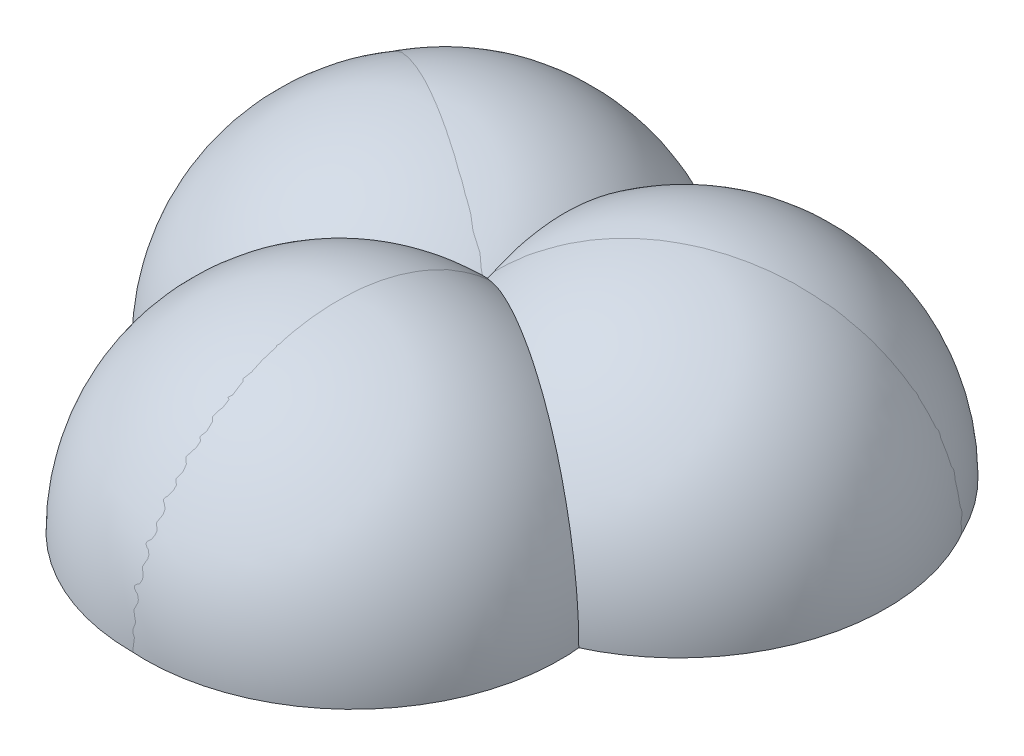
ISO-10303-21;
HEADER;
FILE_DESCRIPTION(('STEP AP214'),'2;1');
FILE_NAME('part.step','',(''),(''),'','','');
FILE_SCHEMA(('AUTOMOTIVE_DESIGN { 1 0 10303 214 1 1 1 1 }'));
ENDSEC;
DATA;
#1=APPLICATION_CONTEXT('core data for automotive mechanical design processes');
#2=APPLICATION_PROTOCOL_DEFINITION('international standard','automotive_design',2000,#1);
#3=PRODUCT_CONTEXT('',#1,'mechanical');
#4=PRODUCT('Part','Part','',(#3));
#5=PRODUCT_RELATED_PRODUCT_CATEGORY('part','',(#4));
#6=PRODUCT_DEFINITION_FORMATION('','',#4);
#7=PRODUCT_DEFINITION_CONTEXT('part definition',#1,'design');
#8=PRODUCT_DEFINITION('design','',#6,#7);
#9=PRODUCT_DEFINITION_SHAPE('','',#8);
#10=(LENGTH_UNIT() NAMED_UNIT(*) SI_UNIT(.MILLI.,.METRE.));
#11=(NAMED_UNIT(*) PLANE_ANGLE_UNIT() SI_UNIT($,.RADIAN.));
#12=(NAMED_UNIT(*) SI_UNIT($,.STERADIAN.) SOLID_ANGLE_UNIT());
#13=UNCERTAINTY_MEASURE_WITH_UNIT(LENGTH_MEASURE(1.E-05),#10,'distance_accuracy_value','');
#14=(GEOMETRIC_REPRESENTATION_CONTEXT(3) GLOBAL_UNCERTAINTY_ASSIGNED_CONTEXT((#13)) GLOBAL_UNIT_ASSIGNED_CONTEXT((#10,
#11,#12)) REPRESENTATION_CONTEXT('',''));
#15=CARTESIAN_POINT('',(0.,0.,0.));
#16=DIRECTION('',(0.,0.,1.));
#17=DIRECTION('',(1.,0.,0.));
#18=AXIS2_PLACEMENT_3D('',#15,#16,#17);
#19=CARTESIAN_POINT('',(6.36854239891027,0.,126.714233632192));
#20=DIRECTION('',(0.,0.,-1.));
#21=DIRECTION('',(1.,0.,0.));
#22=AXIS2_PLACEMENT_3D('',#19,#20,#21);
#23=SPHERICAL_SURFACE('',#22,119.9896);
#24=CARTESIAN_POINT('',(6.36854239891027,0.,126.714233632192));
#25=DIRECTION('',(0.,1.,0.));
#26=DIRECTION('',(0.,0.,1.));
#27=AXIS2_PLACEMENT_3D('',#24,#25,#26);
#28=SPHERICAL_SURFACE('',#27,119.9896);
#29=CARTESIAN_POINT('',(6.36854239891027,0.,126.714233632192));
#30=DIRECTION('',(0.,1.,0.));
#31=DIRECTION('',(0.,0.,1.));
#32=AXIS2_PLACEMENT_3D('',#29,#30,#31);
#33=CIRCLE('',#32,119.9896);
#34=CARTESIAN_POINT('',(6.36854239891023,0.,246.703833632192));
#35=VERTEX_POINT('',#34);
#36=EDGE_CURVE('E82',#35,#35,#33,.T.);
#37=ORIENTED_EDGE('',*,*,#36,.F.);
#38=EDGE_LOOP('',(#37));
#39=FACE_BOUND('',#38,.T.);
#40=ADVANCED_FACE('F75',(#39),#28,.F.);
#41=CARTESIAN_POINT('',(6.36854239891027,0.,126.714233632192));
#42=DIRECTION('',(0.,0.,-1.));
#43=DIRECTION('',(-1.,0.,0.));
#44=AXIS2_PLACEMENT_3D('',#41,#42,#43);
#45=SPHERICAL_SURFACE('',#44,185.293);
#46=CARTESIAN_POINT('',(6.36854239891027,0.,126.714233632192));
#47=DIRECTION('',(0.,-1.,0.));
#48=DIRECTION('',(0.,0.,1.));
#49=AXIS2_PLACEMENT_3D('',#46,#47,#48);
#50=SPHERICAL_SURFACE('',#49,185.293);
#51=CARTESIAN_POINT('',(6.36854239891027,0.,126.714233632192));
#52=DIRECTION('',(0.,-1.,0.));
#53=DIRECTION('',(0.,0.,1.));
#54=AXIS2_PLACEMENT_3D('',#51,#52,#53);
#55=CIRCLE('',#54,185.293);
#56=CARTESIAN_POINT('',(6.36854239891021,0.,312.007233632192));
#57=VERTEX_POINT('',#56);
#58=EDGE_CURVE('E11',#57,#57,#55,.T.);
#59=ORIENTED_EDGE('',*,*,#58,.F.);
#60=EDGE_LOOP('',(#59));
#61=FACE_BOUND('',#60,.T.);
#62=ADVANCED_FACE('F77',(#61),#50,.T.);
#63=CARTESIAN_POINT('',(6.36854239891027,0.,126.714233632192));
#64=DIRECTION('',(0.,-1.,0.));
#65=DIRECTION('',(0.,0.,1.));
#66=AXIS2_PLACEMENT_3D('',#63,#64,#65);
#67=PLANE('',#66);
#68=ORIENTED_EDGE('',*,*,#58,.T.);
#69=EDGE_LOOP('',(#68));
#70=FACE_BOUND('',#69,.T.);
#71=ORIENTED_EDGE('',*,*,#36,.T.);
#72=EDGE_LOOP('',(#71));
#73=FACE_BOUND('',#72,.T.);
#74=ADVANCED_FACE('F88',(#70,#73),#67,.T.);
#75=CLOSED_SHELL('',(#40,#62,#74));
#76=MANIFOLD_SOLID_BREP('B2',#75);
#77=CARTESIAN_POINT('',(112.10167516833,0.,-58.3769299874069));
#78=DIRECTION('',(0.,0.,-1.));
#79=DIRECTION('',(1.,0.,0.));
#80=AXIS2_PLACEMENT_3D('',#77,#78,#79);
#81=SPHERICAL_SURFACE('',#80,119.9896);
#82=CARTESIAN_POINT('',(112.10167516833,0.,-58.3769299874069));
#83=DIRECTION('',(0.,1.,0.));
#84=DIRECTION('',(0.,0.,1.));
#85=AXIS2_PLACEMENT_3D('',#82,#83,#84);
#86=SPHERICAL_SURFACE('',#85,119.9896);
#87=CARTESIAN_POINT('',(112.10167516833,0.,-58.3769299874069));
#88=DIRECTION('',(0.,1.,0.));
#89=DIRECTION('',(0.,0.,1.));
#90=AXIS2_PLACEMENT_3D('',#87,#88,#89);
#91=CIRCLE('',#90,119.9896);
#92=CARTESIAN_POINT('',(112.10167516833,0.,61.6126700125931));
#93=VERTEX_POINT('',#92);
#94=EDGE_CURVE('E134',#93,#93,#91,.T.);
#95=ORIENTED_EDGE('',*,*,#94,.F.);
#96=EDGE_LOOP('',(#95));
#97=FACE_BOUND('',#96,.T.);
#98=ADVANCED_FACE('F126',(#97),#86,.F.);
#99=CARTESIAN_POINT('',(112.10167516833,0.,-58.3769299874069));
#100=DIRECTION('',(0.,0.,-1.));
#101=DIRECTION('',(1.,0.,0.));
#102=AXIS2_PLACEMENT_3D('',#99,#100,#101);
#103=SPHERICAL_SURFACE('',#102,185.293);
#104=CARTESIAN_POINT('',(112.10167516833,0.,-58.3769299874069));
#105=DIRECTION('',(0.,-1.,0.));
#106=DIRECTION('',(0.,0.,1.));
#107=AXIS2_PLACEMENT_3D('',#104,#105,#106);
#108=SPHERICAL_SURFACE('',#107,185.293);
#109=CARTESIAN_POINT('',(112.10167516833,0.,-58.3769299874069));
#110=DIRECTION('',(0.,-1.,0.));
#111=DIRECTION('',(0.,0.,1.));
#112=AXIS2_PLACEMENT_3D('',#109,#110,#111);
#113=CIRCLE('',#112,185.293);
#114=CARTESIAN_POINT('',(112.10167516833,0.,126.916070012593));
#115=VERTEX_POINT('',#114);
#116=EDGE_CURVE('E74',#115,#115,#113,.T.);
#117=ORIENTED_EDGE('',*,*,#116,.F.);
#118=EDGE_LOOP('',(#117));
#119=FACE_BOUND('',#118,.T.);
#120=ADVANCED_FACE('F128',(#119),#108,.T.);
#121=CARTESIAN_POINT('',(112.10167516833,0.,-58.3769299874069));
#122=DIRECTION('',(0.,-1.,0.));
#123=DIRECTION('',(0.,0.,1.));
#124=AXIS2_PLACEMENT_3D('',#121,#122,#123);
#125=PLANE('',#124);
#126=ORIENTED_EDGE('',*,*,#116,.T.);
#127=EDGE_LOOP('',(#126));
#128=FACE_BOUND('',#127,.T.);
#129=ORIENTED_EDGE('',*,*,#94,.T.);
#130=EDGE_LOOP('',(#129));
#131=FACE_BOUND('',#130,.T.);
#132=ADVANCED_FACE('F141',(#128,#131),#125,.T.);
#133=CLOSED_SHELL('',(#98,#120,#132));
#134=MANIFOLD_SOLID_BREP('B6',#133);
#135=CARTESIAN_POINT('',(-112.90953500326,0.,-57.8407716922414));
#136=DIRECTION('',(0.,0.,-1.));
#137=DIRECTION('',(1.,0.,0.));
#138=AXIS2_PLACEMENT_3D('',#135,#136,#137);
#139=SPHERICAL_SURFACE('',#138,119.9896);
#140=CARTESIAN_POINT('',(-112.90953500326,0.,-57.8407716922414));
#141=DIRECTION('',(0.,1.,0.));
#142=DIRECTION('',(0.,0.,1.));
#143=AXIS2_PLACEMENT_3D('',#140,#141,#142);
#144=SPHERICAL_SURFACE('',#143,119.9896);
#145=CARTESIAN_POINT('',(-112.90953500326,0.,-57.8407716922414));
#146=DIRECTION('',(0.,1.,0.));
#147=DIRECTION('',(0.,0.,1.));
#148=AXIS2_PLACEMENT_3D('',#145,#146,#147);
#149=CIRCLE('',#148,119.9896);
#150=CARTESIAN_POINT('',(-112.90953500326,0.,62.1488283077586));
#151=VERTEX_POINT('',#150);
#152=EDGE_CURVE('E186',#151,#151,#149,.T.);
#153=ORIENTED_EDGE('',*,*,#152,.F.);
#154=EDGE_LOOP('',(#153));
#155=FACE_BOUND('',#154,.T.);
#156=ADVANCED_FACE('F179',(#155),#144,.F.);
#157=CARTESIAN_POINT('',(-112.90953500326,0.,-57.8407716922414));
#158=DIRECTION('',(0.,0.,-1.));
#159=DIRECTION('',(-1.,0.,0.));
#160=AXIS2_PLACEMENT_3D('',#157,#158,#159);
#161=SPHERICAL_SURFACE('',#160,185.293);
#162=CARTESIAN_POINT('',(-112.90953500326,0.,-57.8407716922414));
#163=DIRECTION('',(0.,-1.,0.));
#164=DIRECTION('',(0.,0.,1.));
#165=AXIS2_PLACEMENT_3D('',#162,#163,#164);
#166=SPHERICAL_SURFACE('',#165,185.293);
#167=CARTESIAN_POINT('',(-112.90953500326,0.,-57.8407716922414));
#168=DIRECTION('',(0.,-1.,0.));
#169=DIRECTION('',(0.,0.,1.));
#170=AXIS2_PLACEMENT_3D('',#167,#168,#169);
#171=CIRCLE('',#170,185.293);
#172=CARTESIAN_POINT('',(-112.90953500326,0.,127.452228307758));
#173=VERTEX_POINT('',#172);
#174=EDGE_CURVE('E125',#173,#173,#171,.T.);
#175=ORIENTED_EDGE('',*,*,#174,.F.);
#176=EDGE_LOOP('',(#175));
#177=FACE_BOUND('',#176,.T.);
#178=ADVANCED_FACE('F181',(#177),#166,.T.);
#179=CARTESIAN_POINT('',(-112.90953500326,0.,-57.8407716922414));
#180=DIRECTION('',(0.,-1.,0.));
#181=DIRECTION('',(0.,0.,1.));
#182=AXIS2_PLACEMENT_3D('',#179,#180,#181);
#183=PLANE('',#182);
#184=ORIENTED_EDGE('',*,*,#174,.T.);
#185=EDGE_LOOP('',(#184));
#186=FACE_BOUND('',#185,.T.);
#187=ORIENTED_EDGE('',*,*,#152,.T.);
#188=EDGE_LOOP('',(#187));
#189=FACE_BOUND('',#188,.T.);
#190=ADVANCED_FACE('F192',(#186,#189),#183,.T.);
#191=CLOSED_SHELL('',(#156,#178,#190));
#192=MANIFOLD_SOLID_BREP('B69',#191);
#193=CARTESIAN_POINT('',(-5.50028577738214,0.,126.282685640028));
#194=DIRECTION('',(0.,0.,-1.));
#195=DIRECTION('',(1.,0.,0.));
#196=AXIS2_PLACEMENT_3D('',#193,#194,#195);
#197=SPHERICAL_SURFACE('',#196,119.9896);
#198=CARTESIAN_POINT('',(-5.50028577738214,0.,126.282685640028));
#199=DIRECTION('',(0.,1.,0.));
#200=DIRECTION('',(0.,0.,1.));
#201=AXIS2_PLACEMENT_3D('',#198,#199,#200);
#202=SPHERICAL_SURFACE('',#201,119.9896);
#203=CARTESIAN_POINT('',(-5.50028577738214,0.,126.282685640028));
#204=DIRECTION('',(0.,1.,0.));
#205=DIRECTION('',(0.,0.,1.));
#206=AXIS2_PLACEMENT_3D('',#203,#204,#205);
#207=CIRCLE('',#206,119.9896);
#208=CARTESIAN_POINT('',(-5.50028577738218,0.,246.272285640028));
#209=VERTEX_POINT('',#208);
#210=EDGE_CURVE('E237',#209,#209,#207,.T.);
#211=ORIENTED_EDGE('',*,*,#210,.F.);
#212=EDGE_LOOP('',(#211));
#213=FACE_BOUND('',#212,.T.);
#214=ADVANCED_FACE('F230',(#213),#202,.F.);
#215=CARTESIAN_POINT('',(-5.50028577738214,0.,126.282685640028));
#216=DIRECTION('',(0.,0.,-1.));
#217=DIRECTION('',(-1.,0.,0.));
#218=AXIS2_PLACEMENT_3D('',#215,#216,#217);
#219=SPHERICAL_SURFACE('',#218,185.293);
#220=CARTESIAN_POINT('',(-5.50028577738214,0.,126.282685640028));
#221=DIRECTION('',(0.,-1.,0.));
#222=DIRECTION('',(0.,0.,1.));
#223=AXIS2_PLACEMENT_3D('',#220,#221,#222);
#224=SPHERICAL_SURFACE('',#223,185.293);
#225=CARTESIAN_POINT('',(-5.50028577738214,0.,126.282685640028));
#226=DIRECTION('',(0.,-1.,0.));
#227=DIRECTION('',(0.,0.,1.));
#228=AXIS2_PLACEMENT_3D('',#225,#226,#227);
#229=CIRCLE('',#228,185.293);
#230=CARTESIAN_POINT('',(-5.5002857773822,0.,311.575685640028));
#231=VERTEX_POINT('',#230);
#232=EDGE_CURVE('E178',#231,#231,#229,.T.);
#233=ORIENTED_EDGE('',*,*,#232,.F.);
#234=EDGE_LOOP('',(#233));
#235=FACE_BOUND('',#234,.T.);
#236=ADVANCED_FACE('F232',(#235),#224,.T.);
#237=CARTESIAN_POINT('',(-5.50028577738214,0.,126.282685640028));
#238=DIRECTION('',(0.,-1.,0.));
#239=DIRECTION('',(0.,0.,1.));
#240=AXIS2_PLACEMENT_3D('',#237,#238,#239);
#241=PLANE('',#240);
#242=ORIENTED_EDGE('',*,*,#232,.T.);
#243=EDGE_LOOP('',(#242));
#244=FACE_BOUND('',#243,.T.);
#245=ORIENTED_EDGE('',*,*,#210,.T.);
#246=EDGE_LOOP('',(#245));
#247=FACE_BOUND('',#246,.T.);
#248=ADVANCED_FACE('F243',(#244,#247),#241,.T.);
#249=CLOSED_SHELL('',(#214,#236,#248));
#250=MANIFOLD_SOLID_BREP('B120',#249);
#251=CARTESIAN_POINT('',(106.546345161607,0.,-68.8621397961902));
#252=DIRECTION('',(0.,0.,-1.));
#253=DIRECTION('',(1.,0.,0.));
#254=AXIS2_PLACEMENT_3D('',#251,#252,#253);
#255=SPHERICAL_SURFACE('',#254,119.9896);
#256=CARTESIAN_POINT('',(106.546345161607,0.,-68.8621397961902));
#257=DIRECTION('',(0.,1.,0.));
#258=DIRECTION('',(0.,0.,1.));
#259=AXIS2_PLACEMENT_3D('',#256,#257,#258);
#260=SPHERICAL_SURFACE('',#259,119.9896);
#261=CARTESIAN_POINT('',(106.546345161607,0.,-68.8621397961902));
#262=DIRECTION('',(0.,1.,0.));
#263=DIRECTION('',(0.,0.,1.));
#264=AXIS2_PLACEMENT_3D('',#261,#262,#263);
#265=CIRCLE('',#264,119.9896);
#266=CARTESIAN_POINT('',(106.546345161607,0.,51.1274602038098));
#267=VERTEX_POINT('',#266);
#268=EDGE_CURVE('E287',#267,#267,#265,.T.);
#269=ORIENTED_EDGE('',*,*,#268,.F.);
#270=EDGE_LOOP('',(#269));
#271=FACE_BOUND('',#270,.T.);
#272=ADVANCED_FACE('F280',(#271),#260,.F.);
#273=CARTESIAN_POINT('',(106.546345161607,0.,-68.8621397961902));
#274=DIRECTION('',(0.,0.,-1.));
#275=DIRECTION('',(-1.,0.,0.));
#276=AXIS2_PLACEMENT_3D('',#273,#274,#275);
#277=SPHERICAL_SURFACE('',#276,185.293);
#278=CARTESIAN_POINT('',(106.546345161607,0.,-68.8621397961902));
#279=DIRECTION('',(0.,-1.,0.));
#280=DIRECTION('',(0.,0.,1.));
#281=AXIS2_PLACEMENT_3D('',#278,#279,#280);
#282=SPHERICAL_SURFACE('',#281,185.293);
#283=CARTESIAN_POINT('',(106.546345161607,0.,-68.8621397961902));
#284=DIRECTION('',(0.,-1.,0.));
#285=DIRECTION('',(0.,0.,1.));
#286=AXIS2_PLACEMENT_3D('',#283,#284,#285);
#287=CIRCLE('',#286,185.293);
#288=CARTESIAN_POINT('',(106.546345161607,0.,116.43086020381));
#289=VERTEX_POINT('',#288);
#290=EDGE_CURVE('E229',#289,#289,#287,.T.);
#291=ORIENTED_EDGE('',*,*,#290,.F.);
#292=EDGE_LOOP('',(#291));
#293=FACE_BOUND('',#292,.T.);
#294=ADVANCED_FACE('F282',(#293),#282,.T.);
#295=CARTESIAN_POINT('',(106.546345161607,0.,-68.8621397961902));
#296=DIRECTION('',(0.,-1.,0.));
#297=DIRECTION('',(0.,0.,1.));
#298=AXIS2_PLACEMENT_3D('',#295,#296,#297);
#299=PLANE('',#298);
#300=ORIENTED_EDGE('',*,*,#290,.T.);
#301=EDGE_LOOP('',(#300));
#302=FACE_BOUND('',#301,.T.);
#303=ORIENTED_EDGE('',*,*,#268,.T.);
#304=EDGE_LOOP('',(#303));
#305=FACE_BOUND('',#304,.T.);
#306=ADVANCED_FACE('F293',(#302,#305),#299,.T.);
#307=CLOSED_SHELL('',(#272,#294,#306));
#308=MANIFOLD_SOLID_BREP('B173',#307);
#309=CARTESIAN_POINT('',(-106.577162594301,0.,-68.3873025068832));
#310=DIRECTION('',(0.,0.,-1.));
#311=DIRECTION('',(1.,0.,0.));
#312=AXIS2_PLACEMENT_3D('',#309,#310,#311);
#313=SPHERICAL_SURFACE('',#312,119.9896);
#314=CARTESIAN_POINT('',(-106.577162594301,0.,-68.3873025068832));
#315=DIRECTION('',(0.,1.,0.));
#316=DIRECTION('',(0.,0.,1.));
#317=AXIS2_PLACEMENT_3D('',#314,#315,#316);
#318=SPHERICAL_SURFACE('',#317,119.9896);
#319=CARTESIAN_POINT('',(-106.577162594301,0.,-68.3873025068832));
#320=DIRECTION('',(0.,1.,0.));
#321=DIRECTION('',(0.,0.,1.));
#322=AXIS2_PLACEMENT_3D('',#319,#320,#321);
#323=CIRCLE('',#322,119.9896);
#324=CARTESIAN_POINT('',(-106.577162594301,0.,51.6022974931168));
#325=VERTEX_POINT('',#324);
#326=EDGE_CURVE('E330',#325,#325,#323,.T.);
#327=ORIENTED_EDGE('',*,*,#326,.F.);
#328=EDGE_LOOP('',(#327));
#329=FACE_BOUND('',#328,.T.);
#330=ADVANCED_FACE('F323',(#329),#318,.F.);
#331=CARTESIAN_POINT('',(-106.577162594301,0.,-68.3873025068832));
#332=DIRECTION('',(0.,0.,-1.));
#333=DIRECTION('',(-1.,0.,0.));
#334=AXIS2_PLACEMENT_3D('',#331,#332,#333);
#335=SPHERICAL_SURFACE('',#334,185.293);
#336=CARTESIAN_POINT('',(-106.577162594301,0.,-68.3873025068832));
#337=DIRECTION('',(0.,-1.,0.));
#338=DIRECTION('',(0.,0.,1.));
#339=AXIS2_PLACEMENT_3D('',#336,#337,#338);
#340=SPHERICAL_SURFACE('',#339,185.293);
#341=CARTESIAN_POINT('',(-106.577162594301,0.,-68.3873025068832));
#342=DIRECTION('',(0.,-1.,0.));
#343=DIRECTION('',(0.,0.,1.));
#344=AXIS2_PLACEMENT_3D('',#341,#342,#343);
#345=CIRCLE('',#344,185.293);
#346=CARTESIAN_POINT('',(-106.577162594301,0.,116.905697493117));
#347=VERTEX_POINT('',#346);
#348=EDGE_CURVE('E279',#347,#347,#345,.T.);
#349=ORIENTED_EDGE('',*,*,#348,.F.);
#350=EDGE_LOOP('',(#349));
#351=FACE_BOUND('',#350,.T.);
#352=ADVANCED_FACE('F325',(#351),#340,.T.);
#353=CARTESIAN_POINT('',(-106.577162594301,0.,-68.3873025068832));
#354=DIRECTION('',(0.,-1.,0.));
#355=DIRECTION('',(0.,0.,1.));
#356=AXIS2_PLACEMENT_3D('',#353,#354,#355);
#357=PLANE('',#356);
#358=ORIENTED_EDGE('',*,*,#348,.T.);
#359=EDGE_LOOP('',(#358));
#360=FACE_BOUND('',#359,.T.);
#361=ORIENTED_EDGE('',*,*,#326,.T.);
#362=EDGE_LOOP('',(#361));
#363=FACE_BOUND('',#362,.T.);
#364=ADVANCED_FACE('F336',(#360,#363),#357,.T.);
#365=CLOSED_SHELL('',(#330,#352,#364));
#366=MANIFOLD_SOLID_BREP('B224',#365);
#367=ADVANCED_BREP_SHAPE_REPRESENTATION('',(#18,#76,#134,#192,#250,#308,#366),#14);
#368=SHAPE_DEFINITION_REPRESENTATION(#9,#367);
ENDSEC;
END-ISO-10303-21;
